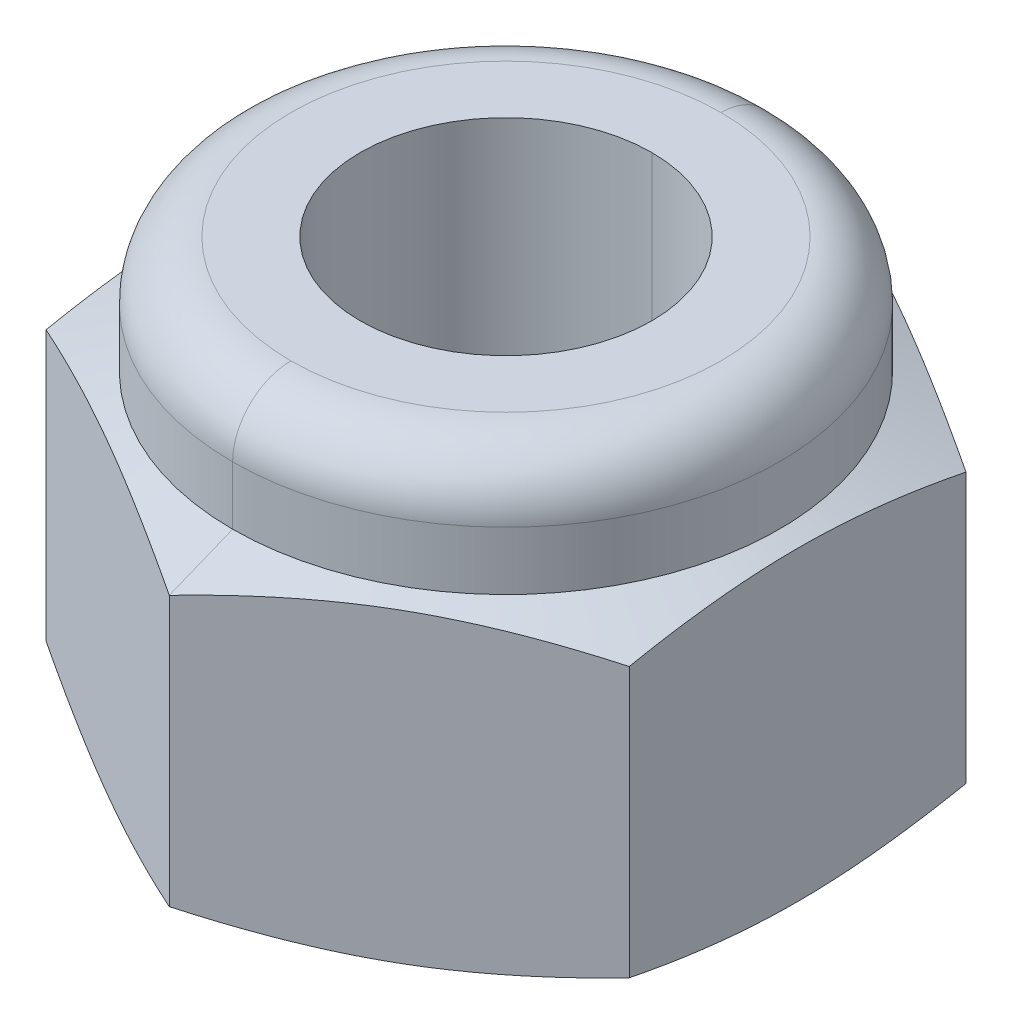
ISO-10303-21;
HEADER;
FILE_DESCRIPTION(('STEP AP214'),'2;1');
FILE_NAME('part.step','',(''),(''),'','','');
FILE_SCHEMA(('AUTOMOTIVE_DESIGN { 1 0 10303 214 1 1 1 1 }'));
ENDSEC;
DATA;
#1=APPLICATION_CONTEXT('core data for automotive mechanical design processes');
#2=APPLICATION_PROTOCOL_DEFINITION('international standard','automotive_design',2000,#1);
#3=PRODUCT_CONTEXT('',#1,'mechanical');
#4=PRODUCT('Part','Part','',(#3));
#5=PRODUCT_RELATED_PRODUCT_CATEGORY('part','',(#4));
#6=PRODUCT_DEFINITION_FORMATION('','',#4);
#7=PRODUCT_DEFINITION_CONTEXT('part definition',#1,'design');
#8=PRODUCT_DEFINITION('design','',#6,#7);
#9=PRODUCT_DEFINITION_SHAPE('','',#8);
#10=(LENGTH_UNIT() NAMED_UNIT(*) SI_UNIT(.MILLI.,.METRE.));
#11=(NAMED_UNIT(*) PLANE_ANGLE_UNIT() SI_UNIT($,.RADIAN.));
#12=(NAMED_UNIT(*) SI_UNIT($,.STERADIAN.) SOLID_ANGLE_UNIT());
#13=UNCERTAINTY_MEASURE_WITH_UNIT(LENGTH_MEASURE(1.E-05),#10,'distance_accuracy_value','');
#14=(GEOMETRIC_REPRESENTATION_CONTEXT(3) GLOBAL_UNCERTAINTY_ASSIGNED_CONTEXT((#13)) GLOBAL_UNIT_ASSIGNED_CONTEXT((#10,
#11,#12)) REPRESENTATION_CONTEXT('',''));
#15=CARTESIAN_POINT('',(0.,0.,0.));
#16=DIRECTION('',(0.,0.,1.));
#17=DIRECTION('',(1.,0.,0.));
#18=AXIS2_PLACEMENT_3D('',#15,#16,#17);
#19=CARTESIAN_POINT('',(0.,2.6,0.));
#20=DIRECTION('',(0.,1.,0.));
#21=DIRECTION('',(0.,0.,1.));
#22=AXIS2_PLACEMENT_3D('',#19,#20,#21);
#23=TOROIDAL_SURFACE('',#22,1.475,0.4);
#24=CARTESIAN_POINT('',(0.,2.6,0.));
#25=DIRECTION('',(0.,-1.,0.));
#26=DIRECTION('',(0.,0.,1.));
#27=AXIS2_PLACEMENT_3D('',#24,#25,#26);
#28=CIRCLE('',#27,1.875);
#29=CARTESIAN_POINT('',(0.,2.6,-1.875));
#30=VERTEX_POINT('',#29);
#31=CARTESIAN_POINT('',(0.,2.6,1.875));
#32=VERTEX_POINT('',#31);
#33=EDGE_CURVE('E438',#30,#32,#28,.T.);
#34=ORIENTED_EDGE('',*,*,#33,.F.);
#35=CARTESIAN_POINT('',(0.,2.6,-1.475));
#36=DIRECTION('',(1.,0.,0.));
#37=DIRECTION('',(0.,0.,-1.));
#38=AXIS2_PLACEMENT_3D('',#35,#36,#37);
#39=CIRCLE('',#38,0.4);
#40=CARTESIAN_POINT('',(0.,3.,-1.475));
#41=VERTEX_POINT('',#40);
#42=EDGE_CURVE('E11',#30,#41,#39,.T.);
#43=ORIENTED_EDGE('',*,*,#42,.T.);
#44=CARTESIAN_POINT('',(0.,3.,0.));
#45=DIRECTION('',(0.,1.,0.));
#46=DIRECTION('',(0.,0.,1.));
#47=AXIS2_PLACEMENT_3D('',#44,#45,#46);
#48=CIRCLE('',#47,1.475);
#49=CARTESIAN_POINT('',(0.,3.,1.475));
#50=VERTEX_POINT('',#49);
#51=EDGE_CURVE('E178',#50,#41,#48,.T.);
#52=ORIENTED_EDGE('',*,*,#51,.F.);
#53=CARTESIAN_POINT('',(0.,2.6,1.475));
#54=DIRECTION('',(-1.,0.,0.));
#55=DIRECTION('',(0.,0.,1.));
#56=AXIS2_PLACEMENT_3D('',#53,#54,#55);
#57=CIRCLE('',#56,0.4);
#58=EDGE_CURVE('E89',#32,#50,#57,.T.);
#59=ORIENTED_EDGE('',*,*,#58,.F.);
#60=EDGE_LOOP('',(#34,#43,#52,#59));
#61=FACE_BOUND('',#60,.T.);
#62=ADVANCED_FACE('F16',(#61),#23,.T.);
#63=CARTESIAN_POINT('',(0.,0.175509427541463,0.));
#64=DIRECTION('',(0.,1.,0.));
#65=DIRECTION('',(0.,0.,1.));
#66=AXIS2_PLACEMENT_3D('',#63,#64,#65);
#67=CONICAL_SURFACE('',#66,2.30940107675851,1.18682389135615);
#68=CARTESIAN_POINT('',(0.,0.,0.));
#69=DIRECTION('',(0.,-1.,0.));
#70=DIRECTION('',(0.,0.,-1.));
#71=AXIS2_PLACEMENT_3D('',#68,#69,#70);
#72=CIRCLE('',#71,1.875);
#73=CARTESIAN_POINT('',(0.,0.,-1.875));
#74=VERTEX_POINT('',#73);
#75=CARTESIAN_POINT('',(0.,0.,1.875));
#76=VERTEX_POINT('',#75);
#77=EDGE_CURVE('E104',#74,#76,#72,.T.);
#78=ORIENTED_EDGE('',*,*,#77,.F.);
#79=DIRECTION('',(0.,0.374606593415907,-0.92718385456679));
#80=VECTOR('',#79,1.);
#81=CARTESIAN_POINT('',(0.,0.175509427541463,-2.30940107675851));
#82=LINE('',#81,#80);
#83=CARTESIAN_POINT('',(0.,0.175509427541463,-2.30940107675851));
#84=VERTEX_POINT('',#83);
#85=EDGE_CURVE('E30',#74,#84,#82,.T.);
#86=ORIENTED_EDGE('',*,*,#85,.T.);
#87=CARTESIAN_POINT('',(2.,0.175509427541465,-1.15470053837925));
#88=CARTESIAN_POINT('',(1.46578302014326,0.05089549057992,-1.46313085550521));
#89=CARTESIAN_POINT('',(1.0026734328639,0.050504240786725,-1.73050730038524));
#90=CARTESIAN_POINT('',(0.537578726600515,0.0501113139015153,-1.99902985424507));
#91=CARTESIAN_POINT('',(0.,0.175509427541465,-2.3094010767585));
#92=B_SPLINE_CURVE_WITH_KNOTS('',2,(#87,#88,#89,#90,#91),.UNSPECIFIED.,.F.,.F.,(3,2,3),(0.,0.5,
1.),.UNSPECIFIED.);
#93=CARTESIAN_POINT('',(2.,0.175509427541463,-1.15470053837925));
#94=VERTEX_POINT('',#93);
#95=EDGE_CURVE('E165',#94,#84,#92,.T.);
#96=ORIENTED_EDGE('',*,*,#95,.F.);
#97=CARTESIAN_POINT('',(2.,0.175509427541465,1.15470053837925));
#98=CARTESIAN_POINT('',(2.,0.0506152837833553,0.536452831810506));
#99=CARTESIAN_POINT('',(2.,0.0505033032714049,0.000497920322228059));
#100=CARTESIAN_POINT('',(2.,0.0503913463042504,-0.535344302389465));
#101=CARTESIAN_POINT('',(2.,0.175509427541465,-1.15470053837924));
#102=B_SPLINE_CURVE_WITH_KNOTS('',2,(#97,#98,#99,#100,#101),.UNSPECIFIED.,.F.,.F.,(3,2,3),(0.,
0.5,1.),.UNSPECIFIED.);
#103=CARTESIAN_POINT('',(2.,0.175509427541463,1.15470053837925));
#104=VERTEX_POINT('',#103);
#105=EDGE_CURVE('E265',#104,#94,#102,.T.);
#106=ORIENTED_EDGE('',*,*,#105,.F.);
#107=CARTESIAN_POINT('',(0.,0.175509427541464,2.3094010767585));
#108=CARTESIAN_POINT('',(0.53421697985773,0.0508954905796889,2.00097075963197));
#109=CARTESIAN_POINT('',(0.997326567136097,0.0505042407867289,1.73359431475251));
#110=CARTESIAN_POINT('',(1.46242127340046,0.0501113139017438,1.46507176089211));
#111=CARTESIAN_POINT('',(2.,0.175509427541464,1.15470053837925));
#112=B_SPLINE_CURVE_WITH_KNOTS('',2,(#107,#108,#109,#110,#111),.UNSPECIFIED.,.F.,.F.,(3,2,3),
(0.,0.5,1.),.UNSPECIFIED.);
#113=CARTESIAN_POINT('',(0.,0.175509427541463,2.30940107675851));
#114=VERTEX_POINT('',#113);
#115=EDGE_CURVE('E312',#114,#104,#112,.T.);
#116=ORIENTED_EDGE('',*,*,#115,.F.);
#117=DIRECTION('',(0.,0.374606593415907,0.92718385456679));
#118=VECTOR('',#117,1.);
#119=CARTESIAN_POINT('',(0.,0.175509427541463,2.30940107675851));
#120=LINE('',#119,#118);
#121=EDGE_CURVE('E173',#76,#114,#120,.T.);
#122=ORIENTED_EDGE('',*,*,#121,.F.);
#123=EDGE_LOOP('',(#78,#86,#96,#106,#116,#122));
#124=FACE_BOUND('',#123,.T.);
#125=ADVANCED_FACE('F206',(#124),#67,.T.);
#126=CARTESIAN_POINT('',(0.,0.,0.));
#127=DIRECTION('',(0.,-1.,0.));
#128=DIRECTION('',(0.,0.,-1.));
#129=AXIS2_PLACEMENT_3D('',#126,#127,#128);
#130=CYLINDRICAL_SURFACE('',#129,1.875);
#131=ORIENTED_EDGE('',*,*,#33,.T.);
#132=DIRECTION('',(0.,-1.,0.));
#133=VECTOR('',#132,1.);
#134=CARTESIAN_POINT('',(0.,0.,1.875));
#135=LINE('',#134,#133);
#136=CARTESIAN_POINT('',(0.,2.2,1.875));
#137=VERTEX_POINT('',#136);
#138=EDGE_CURVE('E440',#32,#137,#135,.T.);
#139=ORIENTED_EDGE('',*,*,#138,.T.);
#140=CARTESIAN_POINT('',(0.,2.2,0.));
#141=DIRECTION('',(0.,-1.,0.));
#142=DIRECTION('',(0.,0.,-1.));
#143=AXIS2_PLACEMENT_3D('',#140,#141,#142);
#144=CIRCLE('',#143,1.875);
#145=CARTESIAN_POINT('',(0.,2.2,-1.875));
#146=VERTEX_POINT('',#145);
#147=EDGE_CURVE('E344',#146,#137,#144,.T.);
#148=ORIENTED_EDGE('',*,*,#147,.F.);
#149=DIRECTION('',(0.,-1.,0.));
#150=VECTOR('',#149,1.);
#151=CARTESIAN_POINT('',(0.,0.,-1.875));
#152=LINE('',#151,#150);
#153=EDGE_CURVE('E45',#30,#146,#152,.T.);
#154=ORIENTED_EDGE('',*,*,#153,.F.);
#155=EDGE_LOOP('',(#131,#139,#148,#154));
#156=FACE_BOUND('',#155,.T.);
#157=ADVANCED_FACE('F244',(#156),#130,.T.);
#158=CARTESIAN_POINT('',(0.,2.2,0.));
#159=DIRECTION('',(0.,-1.,0.));
#160=DIRECTION('',(0.,0.,-1.));
#161=AXIS2_PLACEMENT_3D('',#158,#159,#160);
#162=CONICAL_SURFACE('',#161,1.875,1.18682389135614);
#163=ORIENTED_EDGE('',*,*,#147,.T.);
#164=DIRECTION('',(0.,-0.374606593415913,0.927183854566787));
#165=VECTOR('',#164,1.);
#166=CARTESIAN_POINT('',(0.,2.2,1.875));
#167=LINE('',#166,#165);
#168=CARTESIAN_POINT('',(0.,2.02449057245853,2.30940107675851));
#169=VERTEX_POINT('',#168);
#170=EDGE_CURVE('E343',#137,#169,#167,.T.);
#171=ORIENTED_EDGE('',*,*,#170,.T.);
#172=CARTESIAN_POINT('',(2.,2.02449057245853,1.15470053837925));
#173=CARTESIAN_POINT('',(1.46578302014227,2.14910450942031,1.46313085550578));
#174=CARTESIAN_POINT('',(1.0026734328639,2.14949575921327,1.73050730038524));
#175=CARTESIAN_POINT('',(0.537578726599555,2.14988868609825,1.99902985424563));
#176=CARTESIAN_POINT('',(0.,2.02449057245853,2.3094010767585));
#177=B_SPLINE_CURVE_WITH_KNOTS('',2,(#172,#173,#174,#175,#176),.UNSPECIFIED.,.F.,.F.,(3,2,3),
(0.,0.5,1.),.UNSPECIFIED.);
#178=CARTESIAN_POINT('',(2.,2.02449057245854,1.15470053837925));
#179=VERTEX_POINT('',#178);
#180=EDGE_CURVE('E298',#179,#169,#177,.T.);
#181=ORIENTED_EDGE('',*,*,#180,.F.);
#182=CARTESIAN_POINT('',(2.,2.02449057245853,-1.15470053837925));
#183=CARTESIAN_POINT('',(2.,2.14949253709298,-0.535919099743405));
#184=CARTESIAN_POINT('',(2.,2.14949669672859,0.000497920322224156));
#185=CARTESIAN_POINT('',(2.,2.14950084832294,0.535877957711404));
#186=CARTESIAN_POINT('',(2.,2.02449057245853,1.15470053837925));
#187=B_SPLINE_CURVE_WITH_KNOTS('',2,(#182,#183,#184,#185,#186),.UNSPECIFIED.,.F.,.F.,(3,2,3),
(0.,0.5,1.),.UNSPECIFIED.);
#188=CARTESIAN_POINT('',(2.,2.02449057245853,-1.15470053837925));
#189=VERTEX_POINT('',#188);
#190=EDGE_CURVE('E294',#189,#179,#187,.T.);
#191=ORIENTED_EDGE('',*,*,#190,.F.);
#192=CARTESIAN_POINT('',(0.,2.02449057245853,-2.3094010767585));
#193=CARTESIAN_POINT('',(0.534216979858699,2.14910450942054,-2.00097075963141));
#194=CARTESIAN_POINT('',(0.997326567136098,2.14949575921327,-1.73359431475251));
#195=CARTESIAN_POINT('',(1.46242127340144,2.14988868609803,-1.46507176089154));
#196=CARTESIAN_POINT('',(2.,2.02449057245853,-1.15470053837925));
#197=B_SPLINE_CURVE_WITH_KNOTS('',2,(#192,#193,#194,#195,#196),.UNSPECIFIED.,.F.,.F.,(3,2,3),
(0.,0.5,1.),.UNSPECIFIED.);
#198=CARTESIAN_POINT('',(0.,2.02449057245853,-2.30940107675851));
#199=VERTEX_POINT('',#198);
#200=EDGE_CURVE('E228',#199,#189,#197,.T.);
#201=ORIENTED_EDGE('',*,*,#200,.F.);
#202=DIRECTION('',(0.,-0.374606593415913,-0.927183854566787));
#203=VECTOR('',#202,1.);
#204=CARTESIAN_POINT('',(0.,2.2,-1.875));
#205=LINE('',#204,#203);
#206=EDGE_CURVE('E186',#146,#199,#205,.T.);
#207=ORIENTED_EDGE('',*,*,#206,.F.);
#208=EDGE_LOOP('',(#163,#171,#181,#191,#201,#207));
#209=FACE_BOUND('',#208,.T.);
#210=ADVANCED_FACE('F234',(#209),#162,.T.);
#211=CARTESIAN_POINT('',(0.,3.,0.));
#212=DIRECTION('',(0.,-1.,0.));
#213=DIRECTION('',(0.,0.,-1.));
#214=AXIS2_PLACEMENT_3D('',#211,#212,#213);
#215=CYLINDRICAL_SURFACE('',#214,1.);
#216=CARTESIAN_POINT('',(0.,3.,0.));
#217=DIRECTION('',(0.,1.,0.));
#218=DIRECTION('',(0.,0.,1.));
#219=AXIS2_PLACEMENT_3D('',#216,#217,#218);
#220=CIRCLE('',#219,1.);
#221=CARTESIAN_POINT('',(0.,3.,-1.));
#222=VERTEX_POINT('',#221);
#223=CARTESIAN_POINT('',(0.,3.,1.));
#224=VERTEX_POINT('',#223);
#225=EDGE_CURVE('E182',#222,#224,#220,.T.);
#226=ORIENTED_EDGE('',*,*,#225,.T.);
#227=DIRECTION('',(0.,-1.,0.));
#228=VECTOR('',#227,1.);
#229=CARTESIAN_POINT('',(0.,3.,1.));
#230=LINE('',#229,#228);
#231=CARTESIAN_POINT('',(0.,0.,1.));
#232=VERTEX_POINT('',#231);
#233=EDGE_CURVE('E152',#224,#232,#230,.T.);
#234=ORIENTED_EDGE('',*,*,#233,.T.);
#235=CARTESIAN_POINT('',(0.,0.,0.));
#236=DIRECTION('',(0.,1.,0.));
#237=DIRECTION('',(0.,0.,1.));
#238=AXIS2_PLACEMENT_3D('',#235,#236,#237);
#239=CIRCLE('',#238,1.);
#240=CARTESIAN_POINT('',(0.,0.,-1.));
#241=VERTEX_POINT('',#240);
#242=EDGE_CURVE('E150',#241,#232,#239,.T.);
#243=ORIENTED_EDGE('',*,*,#242,.F.);
#244=DIRECTION('',(0.,-1.,0.));
#245=VECTOR('',#244,1.);
#246=CARTESIAN_POINT('',(0.,3.,-1.));
#247=LINE('',#246,#245);
#248=EDGE_CURVE('E136',#222,#241,#247,.T.);
#249=ORIENTED_EDGE('',*,*,#248,.F.);
#250=EDGE_LOOP('',(#226,#234,#243,#249));
#251=FACE_BOUND('',#250,.T.);
#252=ADVANCED_FACE('F151',(#251),#215,.F.);
#253=CARTESIAN_POINT('',(0.,3.,-2.30940107675851));
#254=DIRECTION('',(0.,1.,0.));
#255=DIRECTION('',(1.,0.,0.));
#256=AXIS2_PLACEMENT_3D('',#253,#254,#255);
#257=PLANE('',#256);
#258=ORIENTED_EDGE('',*,*,#51,.T.);
#259=CARTESIAN_POINT('',(0.,3.,0.));
#260=DIRECTION('',(0.,1.,0.));
#261=DIRECTION('',(0.,0.,1.));
#262=AXIS2_PLACEMENT_3D('',#259,#260,#261);
#263=CIRCLE('',#262,1.475);
#264=EDGE_CURVE('E174',#41,#50,#263,.T.);
#265=ORIENTED_EDGE('',*,*,#264,.T.);
#266=EDGE_LOOP('',(#258,#265));
#267=FACE_BOUND('',#266,.T.);
#268=ORIENTED_EDGE('',*,*,#225,.F.);
#269=CARTESIAN_POINT('',(0.,3.,0.));
#270=DIRECTION('',(0.,1.,0.));
#271=DIRECTION('',(0.,0.,1.));
#272=AXIS2_PLACEMENT_3D('',#269,#270,#271);
#273=CIRCLE('',#272,1.);
#274=EDGE_CURVE('E142',#224,#222,#273,.T.);
#275=ORIENTED_EDGE('',*,*,#274,.F.);
#276=EDGE_LOOP('',(#268,#275));
#277=FACE_BOUND('',#276,.T.);
#278=ADVANCED_FACE('F669',(#267,#277),#257,.T.);
#279=CARTESIAN_POINT('',(0.,0.,-2.30940107675851));
#280=DIRECTION('',(0.,1.,0.));
#281=DIRECTION('',(1.,0.,0.));
#282=AXIS2_PLACEMENT_3D('',#279,#280,#281);
#283=PLANE('',#282);
#284=CARTESIAN_POINT('',(0.,0.,0.));
#285=DIRECTION('',(0.,-1.,0.));
#286=DIRECTION('',(0.,0.,-1.));
#287=AXIS2_PLACEMENT_3D('',#284,#285,#286);
#288=CIRCLE('',#287,1.875);
#289=EDGE_CURVE('E179',#76,#74,#288,.T.);
#290=ORIENTED_EDGE('',*,*,#289,.T.);
#291=ORIENTED_EDGE('',*,*,#77,.T.);
#292=EDGE_LOOP('',(#290,#291));
#293=FACE_BOUND('',#292,.T.);
#294=ORIENTED_EDGE('',*,*,#242,.T.);
#295=CARTESIAN_POINT('',(0.,0.,0.));
#296=DIRECTION('',(0.,1.,0.));
#297=DIRECTION('',(0.,0.,1.));
#298=AXIS2_PLACEMENT_3D('',#295,#296,#297);
#299=CIRCLE('',#298,1.);
#300=EDGE_CURVE('E140',#232,#241,#299,.T.);
#301=ORIENTED_EDGE('',*,*,#300,.T.);
#302=EDGE_LOOP('',(#294,#301));
#303=FACE_BOUND('',#302,.T.);
#304=ADVANCED_FACE('F156',(#293,#303),#283,.F.);
#305=CARTESIAN_POINT('',(2.,3.,-1.15470053837925));
#306=DIRECTION('',(-0.5,0.,0.866025403784439));
#307=DIRECTION('',(0.,1.,0.));
#308=AXIS2_PLACEMENT_3D('',#305,#306,#307);
#309=PLANE('',#308);
#310=DIRECTION('',(0.,-1.,0.));
#311=VECTOR('',#310,1.);
#312=CARTESIAN_POINT('',(2.,3.,-1.15470053837925));
#313=LINE('',#312,#311);
#314=EDGE_CURVE('E158',#189,#94,#313,.T.);
#315=ORIENTED_EDGE('',*,*,#314,.T.);
#316=ORIENTED_EDGE('',*,*,#95,.T.);
#317=DIRECTION('',(0.,-1.,0.));
#318=VECTOR('',#317,1.);
#319=CARTESIAN_POINT('',(0.,3.,-2.30940107675851));
#320=LINE('',#319,#318);
#321=EDGE_CURVE('E301',#199,#84,#320,.T.);
#322=ORIENTED_EDGE('',*,*,#321,.F.);
#323=ORIENTED_EDGE('',*,*,#200,.T.);
#324=EDGE_LOOP('',(#315,#316,#322,#323));
#325=FACE_BOUND('',#324,.T.);
#326=ADVANCED_FACE('F197',(#325),#309,.F.);
#327=CARTESIAN_POINT('',(0.,3.,-2.30940107675851));
#328=DIRECTION('',(0.5,0.,0.866025403784439));
#329=DIRECTION('',(0.,-1.,0.));
#330=AXIS2_PLACEMENT_3D('',#327,#328,#329);
#331=PLANE('',#330);
#332=ORIENTED_EDGE('',*,*,#321,.T.);
#333=CARTESIAN_POINT('',(0.,0.175509427541465,-2.3094010767585));
#334=CARTESIAN_POINT('',(-0.534216979857731,0.0508954905796954,-2.00097075963198));
#335=CARTESIAN_POINT('',(-0.997326567136097,0.0505042407867302,-1.73359431475251));
#336=CARTESIAN_POINT('',(-1.46242127340046,0.0501113139017451,-1.46507176089212));
#337=CARTESIAN_POINT('',(-1.99999999999999,0.175509427541465,-1.15470053837926));
#338=B_SPLINE_CURVE_WITH_KNOTS('',2,(#333,#334,#335,#336,#337),.UNSPECIFIED.,.F.,.F.,(3,2,3),
(0.,0.5,1.),.UNSPECIFIED.);
#339=CARTESIAN_POINT('',(-2.,0.175509427541463,-1.15470053837925));
#340=VERTEX_POINT('',#339);
#341=EDGE_CURVE('E559',#84,#340,#338,.T.);
#342=ORIENTED_EDGE('',*,*,#341,.T.);
#343=DIRECTION('',(0.,-1.,0.));
#344=VECTOR('',#343,1.);
#345=CARTESIAN_POINT('',(-2.,3.,-1.15470053837925));
#346=LINE('',#345,#344);
#347=CARTESIAN_POINT('',(-2.,2.02449057245853,-1.15470053837925));
#348=VERTEX_POINT('',#347);
#349=EDGE_CURVE('E560',#348,#340,#346,.T.);
#350=ORIENTED_EDGE('',*,*,#349,.F.);
#351=CARTESIAN_POINT('',(-1.99999999999999,2.02449057245853,-1.15470053837926));
#352=CARTESIAN_POINT('',(-1.46578302014228,2.14910450942031,-1.46313085550578));
#353=CARTESIAN_POINT('',(-1.0026734328639,2.14949575921327,-1.73050730038525));
#354=CARTESIAN_POINT('',(-0.537578726599546,2.14988868609825,-1.99902985424564));
#355=CARTESIAN_POINT('',(0.,2.02449057245853,-2.3094010767585));
#356=B_SPLINE_CURVE_WITH_KNOTS('',2,(#351,#352,#353,#354,#355),.UNSPECIFIED.,.F.,.F.,(3,2,3),
(0.,0.5,1.),.UNSPECIFIED.);
#357=EDGE_CURVE('E556',#348,#199,#356,.T.);
#358=ORIENTED_EDGE('',*,*,#357,.T.);
#359=EDGE_LOOP('',(#332,#342,#350,#358));
#360=FACE_BOUND('',#359,.T.);
#361=ADVANCED_FACE('F18',(#360),#331,.F.);
#362=CARTESIAN_POINT('',(-2.,3.,-1.15470053837925));
#363=DIRECTION('',(1.,0.,0.));
#364=DIRECTION('',(0.,0.,-1.));
#365=AXIS2_PLACEMENT_3D('',#362,#363,#364);
#366=PLANE('',#365);
#367=ORIENTED_EDGE('',*,*,#349,.T.);
#368=CARTESIAN_POINT('',(-2.,0.175509427541465,-1.15470053837925));
#369=CARTESIAN_POINT('',(-2.,0.0505074629070152,-0.5359190997434));
#370=CARTESIAN_POINT('',(-2.,0.0505033032714049,0.000497920322215916));
#371=CARTESIAN_POINT('',(-2.,0.0504991516770601,0.535877957711415));
#372=CARTESIAN_POINT('',(-2.,0.175509427541465,1.15470053837925));
#373=B_SPLINE_CURVE_WITH_KNOTS('',2,(#368,#369,#370,#371,#372),.UNSPECIFIED.,.F.,.F.,(3,2,3),
(0.,0.5,1.),.UNSPECIFIED.);
#374=CARTESIAN_POINT('',(-2.,0.175509427541463,1.15470053837925));
#375=VERTEX_POINT('',#374);
#376=EDGE_CURVE('E570',#340,#375,#373,.T.);
#377=ORIENTED_EDGE('',*,*,#376,.T.);
#378=DIRECTION('',(0.,-1.,0.));
#379=VECTOR('',#378,1.);
#380=CARTESIAN_POINT('',(-2.,3.,1.15470053837925));
#381=LINE('',#380,#379);
#382=CARTESIAN_POINT('',(-2.,2.02449057245853,1.15470053837925));
#383=VERTEX_POINT('',#382);
#384=EDGE_CURVE('E582',#383,#375,#381,.T.);
#385=ORIENTED_EDGE('',*,*,#384,.F.);
#386=CARTESIAN_POINT('',(-2.,2.02449057245853,1.15470053837925));
#387=CARTESIAN_POINT('',(-2.,2.14938471621642,0.536452831811655));
#388=CARTESIAN_POINT('',(-2.,2.1494966967286,0.000497920322215916));
#389=CARTESIAN_POINT('',(-2.,2.14960865369598,-0.53534430238833));
#390=CARTESIAN_POINT('',(-2.,2.02449057245853,-1.15470053837925));
#391=B_SPLINE_CURVE_WITH_KNOTS('',2,(#386,#387,#388,#389,#390),.UNSPECIFIED.,.F.,.F.,(3,2,3),
(0.,0.5,1.),.UNSPECIFIED.);
#392=EDGE_CURVE('E354',#383,#348,#391,.T.);
#393=ORIENTED_EDGE('',*,*,#392,.T.);
#394=EDGE_LOOP('',(#367,#377,#385,#393));
#395=FACE_BOUND('',#394,.T.);
#396=ADVANCED_FACE('F697',(#395),#366,.F.);
#397=CARTESIAN_POINT('',(-2.,3.,1.15470053837925));
#398=DIRECTION('',(0.5,0.,-0.866025403784439));
#399=DIRECTION('',(0.,-1.,0.));
#400=AXIS2_PLACEMENT_3D('',#397,#398,#399);
#401=PLANE('',#400);
#402=ORIENTED_EDGE('',*,*,#384,.T.);
#403=CARTESIAN_POINT('',(-2.,0.175509427541465,1.15470053837925));
#404=CARTESIAN_POINT('',(-1.46578302014226,0.0508954905796954,1.46313085550578));
#405=CARTESIAN_POINT('',(-1.0026734328639,0.0505042407867302,1.73050730038524));
#406=CARTESIAN_POINT('',(-0.537578726599541,0.0501113139017503,1.99902985424564));
#407=CARTESIAN_POINT('',(0.,0.175509427541465,2.3094010767585));
#408=B_SPLINE_CURVE_WITH_KNOTS('',2,(#403,#404,#405,#406,#407),.UNSPECIFIED.,.F.,.F.,(3,2,3),
(0.,0.5,1.),.UNSPECIFIED.);
#409=EDGE_CURVE('E338',#375,#114,#408,.T.);
#410=ORIENTED_EDGE('',*,*,#409,.T.);
#411=DIRECTION('',(0.,-1.,0.));
#412=VECTOR('',#411,1.);
#413=CARTESIAN_POINT('',(0.,3.,2.3094010767585));
#414=LINE('',#413,#412);
#415=EDGE_CURVE('E329',#169,#114,#414,.T.);
#416=ORIENTED_EDGE('',*,*,#415,.F.);
#417=CARTESIAN_POINT('',(0.,2.02449057245853,2.3094010767585));
#418=CARTESIAN_POINT('',(-0.53421697985772,2.14910450942031,2.00097075963198));
#419=CARTESIAN_POINT('',(-0.997326567136098,2.14949575921327,1.73359431475251));
#420=CARTESIAN_POINT('',(-1.46242127340045,2.14988868609825,1.46507176089212));
#421=CARTESIAN_POINT('',(-2.,2.02449057245853,1.15470053837925));
#422=B_SPLINE_CURVE_WITH_KNOTS('',2,(#417,#418,#419,#420,#421),.UNSPECIFIED.,.F.,.F.,(3,2,3),
(0.,0.5,1.),.UNSPECIFIED.);
#423=EDGE_CURVE('E335',#169,#383,#422,.T.);
#424=ORIENTED_EDGE('',*,*,#423,.T.);
#425=EDGE_LOOP('',(#402,#410,#416,#424));
#426=FACE_BOUND('',#425,.T.);
#427=ADVANCED_FACE('F209',(#426),#401,.F.);
#428=CARTESIAN_POINT('',(0.,3.,2.3094010767585));
#429=DIRECTION('',(-0.5,0.,-0.866025403784439));
#430=DIRECTION('',(-0.866025403784439,0.,0.5));
#431=AXIS2_PLACEMENT_3D('',#428,#429,#430);
#432=PLANE('',#431);
#433=ORIENTED_EDGE('',*,*,#415,.T.);
#434=ORIENTED_EDGE('',*,*,#115,.T.);
#435=DIRECTION('',(0.,-1.,0.));
#436=VECTOR('',#435,1.);
#437=CARTESIAN_POINT('',(2.,3.,1.15470053837925));
#438=LINE('',#437,#436);
#439=EDGE_CURVE('E303',#179,#104,#438,.T.);
#440=ORIENTED_EDGE('',*,*,#439,.F.);
#441=ORIENTED_EDGE('',*,*,#180,.T.);
#442=EDGE_LOOP('',(#433,#434,#440,#441));
#443=FACE_BOUND('',#442,.T.);
#444=ADVANCED_FACE('F280',(#443),#432,.F.);
#445=CARTESIAN_POINT('',(2.,3.,1.15470053837925));
#446=DIRECTION('',(-1.,0.,0.));
#447=DIRECTION('',(0.,1.,0.));
#448=AXIS2_PLACEMENT_3D('',#445,#446,#447);
#449=PLANE('',#448);
#450=ORIENTED_EDGE('',*,*,#439,.T.);
#451=ORIENTED_EDGE('',*,*,#105,.T.);
#452=ORIENTED_EDGE('',*,*,#314,.F.);
#453=ORIENTED_EDGE('',*,*,#190,.T.);
#454=EDGE_LOOP('',(#450,#451,#452,#453));
#455=FACE_BOUND('',#454,.T.);
#456=ADVANCED_FACE('F271',(#455),#449,.F.);
#457=CARTESIAN_POINT('',(0.,3.,0.));
#458=DIRECTION('',(0.,-1.,0.));
#459=DIRECTION('',(0.,0.,-1.));
#460=AXIS2_PLACEMENT_3D('',#457,#458,#459);
#461=CYLINDRICAL_SURFACE('',#460,1.);
#462=ORIENTED_EDGE('',*,*,#233,.F.);
#463=ORIENTED_EDGE('',*,*,#274,.T.);
#464=ORIENTED_EDGE('',*,*,#248,.T.);
#465=ORIENTED_EDGE('',*,*,#300,.F.);
#466=EDGE_LOOP('',(#462,#463,#464,#465));
#467=FACE_BOUND('',#466,.T.);
#468=ADVANCED_FACE('F138',(#467),#461,.F.);
#469=CARTESIAN_POINT('',(0.,2.2,0.));
#470=DIRECTION('',(0.,-1.,0.));
#471=DIRECTION('',(0.,0.,-1.));
#472=AXIS2_PLACEMENT_3D('',#469,#470,#471);
#473=CONICAL_SURFACE('',#472,1.875,1.18682389135614);
#474=ORIENTED_EDGE('',*,*,#170,.F.);
#475=CARTESIAN_POINT('',(0.,2.2,0.));
#476=DIRECTION('',(0.,-1.,0.));
#477=DIRECTION('',(0.,0.,-1.));
#478=AXIS2_PLACEMENT_3D('',#475,#476,#477);
#479=CIRCLE('',#478,1.875);
#480=EDGE_CURVE('E147',#137,#146,#479,.T.);
#481=ORIENTED_EDGE('',*,*,#480,.T.);
#482=ORIENTED_EDGE('',*,*,#206,.T.);
#483=ORIENTED_EDGE('',*,*,#357,.F.);
#484=ORIENTED_EDGE('',*,*,#392,.F.);
#485=ORIENTED_EDGE('',*,*,#423,.F.);
#486=EDGE_LOOP('',(#474,#481,#482,#483,#484,#485));
#487=FACE_BOUND('',#486,.T.);
#488=ADVANCED_FACE('F351',(#487),#473,.T.);
#489=CARTESIAN_POINT('',(0.,0.,0.));
#490=DIRECTION('',(0.,-1.,0.));
#491=DIRECTION('',(0.,0.,-1.));
#492=AXIS2_PLACEMENT_3D('',#489,#490,#491);
#493=CYLINDRICAL_SURFACE('',#492,1.875);
#494=ORIENTED_EDGE('',*,*,#138,.F.);
#495=CARTESIAN_POINT('',(0.,2.6,0.));
#496=DIRECTION('',(0.,-1.,0.));
#497=DIRECTION('',(0.,0.,1.));
#498=AXIS2_PLACEMENT_3D('',#495,#496,#497);
#499=CIRCLE('',#498,1.875);
#500=EDGE_CURVE('E168',#32,#30,#499,.T.);
#501=ORIENTED_EDGE('',*,*,#500,.T.);
#502=ORIENTED_EDGE('',*,*,#153,.T.);
#503=ORIENTED_EDGE('',*,*,#480,.F.);
#504=EDGE_LOOP('',(#494,#501,#502,#503));
#505=FACE_BOUND('',#504,.T.);
#506=ADVANCED_FACE('F374',(#505),#493,.T.);
#507=CARTESIAN_POINT('',(0.,0.175509427541463,0.));
#508=DIRECTION('',(0.,1.,0.));
#509=DIRECTION('',(0.,0.,1.));
#510=AXIS2_PLACEMENT_3D('',#507,#508,#509);
#511=CONICAL_SURFACE('',#510,2.30940107675851,1.18682389135615);
#512=ORIENTED_EDGE('',*,*,#85,.F.);
#513=ORIENTED_EDGE('',*,*,#289,.F.);
#514=ORIENTED_EDGE('',*,*,#121,.T.);
#515=ORIENTED_EDGE('',*,*,#409,.F.);
#516=ORIENTED_EDGE('',*,*,#376,.F.);
#517=ORIENTED_EDGE('',*,*,#341,.F.);
#518=EDGE_LOOP('',(#512,#513,#514,#515,#516,#517));
#519=FACE_BOUND('',#518,.T.);
#520=ADVANCED_FACE('F376',(#519),#511,.T.);
#521=CARTESIAN_POINT('',(0.,2.6,0.));
#522=DIRECTION('',(0.,1.,0.));
#523=DIRECTION('',(0.,0.,1.));
#524=AXIS2_PLACEMENT_3D('',#521,#522,#523);
#525=TOROIDAL_SURFACE('',#524,1.475,0.4);
#526=ORIENTED_EDGE('',*,*,#42,.F.);
#527=ORIENTED_EDGE('',*,*,#500,.F.);
#528=ORIENTED_EDGE('',*,*,#58,.T.);
#529=ORIENTED_EDGE('',*,*,#264,.F.);
#530=EDGE_LOOP('',(#526,#527,#528,#529));
#531=FACE_BOUND('',#530,.T.);
#532=ADVANCED_FACE('F613',(#531),#525,.T.);
#533=CLOSED_SHELL('',(#62,#125,#157,#210,#252,#278,#304,#326,#361,#396,#427,#444,#456,#468,#488,
#506,#520,#532));
#534=MANIFOLD_SOLID_BREP('B1',#533);
#535=ADVANCED_BREP_SHAPE_REPRESENTATION('',(#18,#534),#14);
#536=SHAPE_DEFINITION_REPRESENTATION(#9,#535);
ENDSEC;
END-ISO-10303-21;
